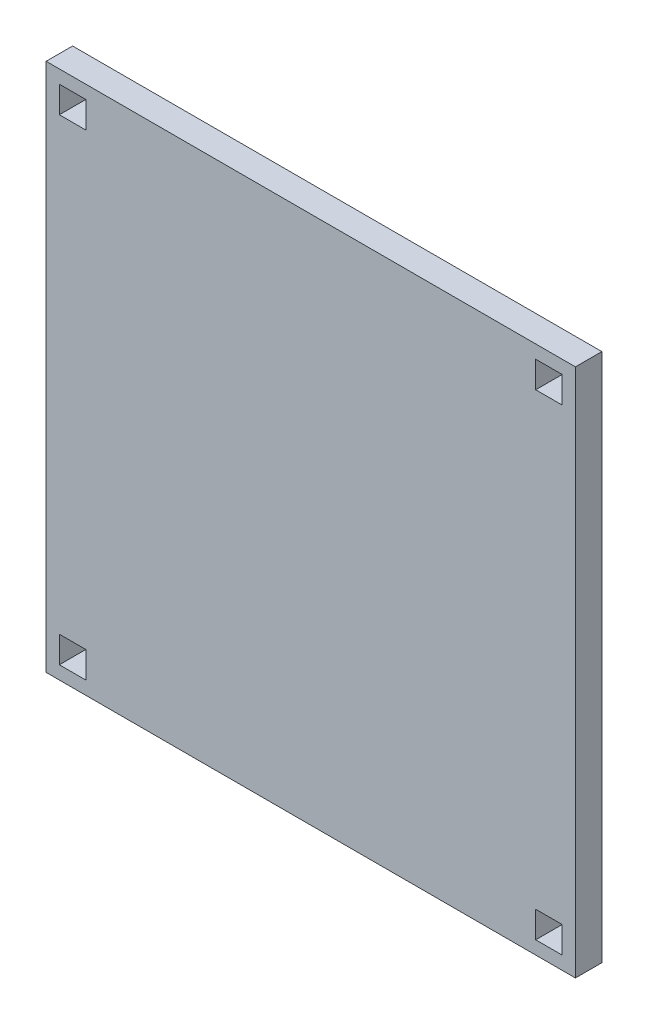
ISO-10303-21;
HEADER;
FILE_DESCRIPTION(('STEP AP214'),'2;1');
FILE_NAME('part.step','',(''),(''),'','','');
FILE_SCHEMA(('AUTOMOTIVE_DESIGN { 1 0 10303 214 1 1 1 1 }'));
ENDSEC;
DATA;
#1=APPLICATION_CONTEXT('core data for automotive mechanical design processes');
#2=APPLICATION_PROTOCOL_DEFINITION('international standard','automotive_design',2000,#1);
#3=PRODUCT_CONTEXT('',#1,'mechanical');
#4=PRODUCT('Part','Part','',(#3));
#5=PRODUCT_RELATED_PRODUCT_CATEGORY('part','',(#4));
#6=PRODUCT_DEFINITION_FORMATION('','',#4);
#7=PRODUCT_DEFINITION_CONTEXT('part definition',#1,'design');
#8=PRODUCT_DEFINITION('design','',#6,#7);
#9=PRODUCT_DEFINITION_SHAPE('','',#8);
#10=(LENGTH_UNIT() NAMED_UNIT(*) SI_UNIT(.MILLI.,.METRE.));
#11=(NAMED_UNIT(*) PLANE_ANGLE_UNIT() SI_UNIT($,.RADIAN.));
#12=(NAMED_UNIT(*) SI_UNIT($,.STERADIAN.) SOLID_ANGLE_UNIT());
#13=UNCERTAINTY_MEASURE_WITH_UNIT(LENGTH_MEASURE(1.E-05),#10,'distance_accuracy_value','');
#14=(GEOMETRIC_REPRESENTATION_CONTEXT(3) GLOBAL_UNCERTAINTY_ASSIGNED_CONTEXT((#13)) GLOBAL_UNIT_ASSIGNED_CONTEXT((#10,
#11,#12)) REPRESENTATION_CONTEXT('',''));
#15=CARTESIAN_POINT('',(0.,0.,0.));
#16=DIRECTION('',(0.,0.,1.));
#17=DIRECTION('',(1.,0.,0.));
#18=AXIS2_PLACEMENT_3D('',#15,#16,#17);
#19=CARTESIAN_POINT('',(0.,0.,50.));
#20=DIRECTION('',(0.,0.,-1.));
#21=DIRECTION('',(-1.,0.,0.));
#22=AXIS2_PLACEMENT_3D('',#19,#20,#21);
#23=PLANE('',#22);
#24=DIRECTION('',(0.,1.,0.));
#25=VECTOR('',#24,1.);
#26=CARTESIAN_POINT('',(475.,-475.,50.));
#27=LINE('',#26,#25);
#28=CARTESIAN_POINT('',(475.,-475.,50.));
#29=VERTEX_POINT('',#28);
#30=CARTESIAN_POINT('',(475.,-425.,50.));
#31=VERTEX_POINT('',#30);
#32=EDGE_CURVE('E214',#29,#31,#27,.T.);
#33=ORIENTED_EDGE('',*,*,#32,.F.);
#34=DIRECTION('',(1.,0.,0.));
#35=VECTOR('',#34,1.);
#36=CARTESIAN_POINT('',(425.,-475.,50.));
#37=LINE('',#36,#35);
#38=CARTESIAN_POINT('',(425.,-475.,50.));
#39=VERTEX_POINT('',#38);
#40=EDGE_CURVE('E222',#39,#29,#37,.T.);
#41=ORIENTED_EDGE('',*,*,#40,.F.);
#42=DIRECTION('',(0.,-1.,0.));
#43=VECTOR('',#42,1.);
#44=CARTESIAN_POINT('',(425.,-475.,50.));
#45=LINE('',#44,#43);
#46=CARTESIAN_POINT('',(425.,-425.,50.));
#47=VERTEX_POINT('',#46);
#48=EDGE_CURVE('E219',#47,#39,#45,.T.);
#49=ORIENTED_EDGE('',*,*,#48,.F.);
#50=DIRECTION('',(-1.,0.,0.));
#51=VECTOR('',#50,1.);
#52=CARTESIAN_POINT('',(425.,-425.,50.));
#53=LINE('',#52,#51);
#54=EDGE_CURVE('E216',#31,#47,#53,.T.);
#55=ORIENTED_EDGE('',*,*,#54,.F.);
#56=EDGE_LOOP('',(#33,#41,#49,#55));
#57=FACE_BOUND('',#56,.T.);
#58=DIRECTION('',(0.,1.,0.));
#59=VECTOR('',#58,1.);
#60=CARTESIAN_POINT('',(475.,425.,50.));
#61=LINE('',#60,#59);
#62=CARTESIAN_POINT('',(475.,425.,50.));
#63=VERTEX_POINT('',#62);
#64=CARTESIAN_POINT('',(475.,475.,50.));
#65=VERTEX_POINT('',#64);
#66=EDGE_CURVE('E276',#63,#65,#61,.T.);
#67=ORIENTED_EDGE('',*,*,#66,.F.);
#68=DIRECTION('',(1.,0.,0.));
#69=VECTOR('',#68,1.);
#70=CARTESIAN_POINT('',(425.,425.,50.));
#71=LINE('',#70,#69);
#72=CARTESIAN_POINT('',(425.,425.,50.));
#73=VERTEX_POINT('',#72);
#74=EDGE_CURVE('E284',#73,#63,#71,.T.);
#75=ORIENTED_EDGE('',*,*,#74,.F.);
#76=DIRECTION('',(0.,-1.,0.));
#77=VECTOR('',#76,1.);
#78=CARTESIAN_POINT('',(425.,425.,50.));
#79=LINE('',#78,#77);
#80=CARTESIAN_POINT('',(425.,475.,50.));
#81=VERTEX_POINT('',#80);
#82=EDGE_CURVE('E281',#81,#73,#79,.T.);
#83=ORIENTED_EDGE('',*,*,#82,.F.);
#84=DIRECTION('',(-1.,0.,0.));
#85=VECTOR('',#84,1.);
#86=CARTESIAN_POINT('',(425.,475.,50.));
#87=LINE('',#86,#85);
#88=EDGE_CURVE('E278',#65,#81,#87,.T.);
#89=ORIENTED_EDGE('',*,*,#88,.F.);
#90=EDGE_LOOP('',(#67,#75,#83,#89));
#91=FACE_BOUND('',#90,.T.);
#92=DIRECTION('',(0.,1.,0.));
#93=VECTOR('',#92,1.);
#94=CARTESIAN_POINT('',(500.,-500.,50.));
#95=LINE('',#94,#93);
#96=CARTESIAN_POINT('',(500.,-500.,50.));
#97=VERTEX_POINT('',#96);
#98=CARTESIAN_POINT('',(500.,500.,50.));
#99=VERTEX_POINT('',#98);
#100=EDGE_CURVE('E307',#97,#99,#95,.T.);
#101=ORIENTED_EDGE('',*,*,#100,.T.);
#102=DIRECTION('',(-1.,0.,0.));
#103=VECTOR('',#102,1.);
#104=CARTESIAN_POINT('',(-500.,500.,50.));
#105=LINE('',#104,#103);
#106=CARTESIAN_POINT('',(-500.,500.,50.));
#107=VERTEX_POINT('',#106);
#108=EDGE_CURVE('E310',#99,#107,#105,.T.);
#109=ORIENTED_EDGE('',*,*,#108,.T.);
#110=DIRECTION('',(0.,-1.,0.));
#111=VECTOR('',#110,1.);
#112=CARTESIAN_POINT('',(-500.,-500.,50.));
#113=LINE('',#112,#111);
#114=CARTESIAN_POINT('',(-500.,-500.,50.));
#115=VERTEX_POINT('',#114);
#116=EDGE_CURVE('E313',#107,#115,#113,.T.);
#117=ORIENTED_EDGE('',*,*,#116,.T.);
#118=DIRECTION('',(1.,0.,0.));
#119=VECTOR('',#118,1.);
#120=CARTESIAN_POINT('',(-500.,-500.,50.));
#121=LINE('',#120,#119);
#122=EDGE_CURVE('E315',#115,#97,#121,.T.);
#123=ORIENTED_EDGE('',*,*,#122,.T.);
#124=EDGE_LOOP('',(#101,#109,#117,#123));
#125=FACE_BOUND('',#124,.T.);
#126=DIRECTION('',(0.,1.,0.));
#127=VECTOR('',#126,1.);
#128=CARTESIAN_POINT('',(-425.,425.,50.));
#129=LINE('',#128,#127);
#130=CARTESIAN_POINT('',(-425.,425.,50.));
#131=VERTEX_POINT('',#130);
#132=CARTESIAN_POINT('',(-425.,475.,50.));
#133=VERTEX_POINT('',#132);
#134=EDGE_CURVE('E245',#131,#133,#129,.T.);
#135=ORIENTED_EDGE('',*,*,#134,.F.);
#136=DIRECTION('',(1.,0.,0.));
#137=VECTOR('',#136,1.);
#138=CARTESIAN_POINT('',(-475.,425.,50.));
#139=LINE('',#138,#137);
#140=CARTESIAN_POINT('',(-475.,425.,50.));
#141=VERTEX_POINT('',#140);
#142=EDGE_CURVE('E253',#141,#131,#139,.T.);
#143=ORIENTED_EDGE('',*,*,#142,.F.);
#144=DIRECTION('',(0.,-1.,0.));
#145=VECTOR('',#144,1.);
#146=CARTESIAN_POINT('',(-475.,425.,50.));
#147=LINE('',#146,#145);
#148=CARTESIAN_POINT('',(-475.,475.,50.));
#149=VERTEX_POINT('',#148);
#150=EDGE_CURVE('E250',#149,#141,#147,.T.);
#151=ORIENTED_EDGE('',*,*,#150,.F.);
#152=DIRECTION('',(-1.,0.,0.));
#153=VECTOR('',#152,1.);
#154=CARTESIAN_POINT('',(-475.,475.,50.));
#155=LINE('',#154,#153);
#156=EDGE_CURVE('E247',#133,#149,#155,.T.);
#157=ORIENTED_EDGE('',*,*,#156,.F.);
#158=EDGE_LOOP('',(#135,#143,#151,#157));
#159=FACE_BOUND('',#158,.T.);
#160=DIRECTION('',(0.,1.,0.));
#161=VECTOR('',#160,1.);
#162=CARTESIAN_POINT('',(-425.,-475.,50.));
#163=LINE('',#162,#161);
#164=CARTESIAN_POINT('',(-425.,-475.,50.));
#165=VERTEX_POINT('',#164);
#166=CARTESIAN_POINT('',(-425.,-425.,50.));
#167=VERTEX_POINT('',#166);
#168=EDGE_CURVE('E178',#165,#167,#163,.T.);
#169=ORIENTED_EDGE('',*,*,#168,.F.);
#170=DIRECTION('',(1.,0.,0.));
#171=VECTOR('',#170,1.);
#172=CARTESIAN_POINT('',(-475.,-475.,50.));
#173=LINE('',#172,#171);
#174=CARTESIAN_POINT('',(-475.,-475.,50.));
#175=VERTEX_POINT('',#174);
#176=EDGE_CURVE('E200',#175,#165,#173,.T.);
#177=ORIENTED_EDGE('',*,*,#176,.F.);
#178=DIRECTION('',(0.,-1.,0.));
#179=VECTOR('',#178,1.);
#180=CARTESIAN_POINT('',(-475.,-475.,50.));
#181=LINE('',#180,#179);
#182=CARTESIAN_POINT('',(-475.,-425.,50.));
#183=VERTEX_POINT('',#182);
#184=EDGE_CURVE('E198',#183,#175,#181,.T.);
#185=ORIENTED_EDGE('',*,*,#184,.F.);
#186=DIRECTION('',(-1.,0.,0.));
#187=VECTOR('',#186,1.);
#188=CARTESIAN_POINT('',(-475.,-425.,50.));
#189=LINE('',#188,#187);
#190=EDGE_CURVE('E186',#167,#183,#189,.T.);
#191=ORIENTED_EDGE('',*,*,#190,.F.);
#192=EDGE_LOOP('',(#169,#177,#185,#191));
#193=FACE_BOUND('',#192,.T.);
#194=ADVANCED_FACE('F41',(#57,#91,#125,#159,#193),#23,.F.);
#195=CARTESIAN_POINT('',(0.,0.,0.));
#196=DIRECTION('',(0.,0.,-1.));
#197=DIRECTION('',(-1.,0.,0.));
#198=AXIS2_PLACEMENT_3D('',#195,#196,#197);
#199=PLANE('',#198);
#200=DIRECTION('',(0.,1.,0.));
#201=VECTOR('',#200,1.);
#202=CARTESIAN_POINT('',(500.,-500.,0.));
#203=LINE('',#202,#201);
#204=CARTESIAN_POINT('',(500.,-500.,0.));
#205=VERTEX_POINT('',#204);
#206=CARTESIAN_POINT('',(500.,500.,0.));
#207=VERTEX_POINT('',#206);
#208=EDGE_CURVE('E306',#205,#207,#203,.T.);
#209=ORIENTED_EDGE('',*,*,#208,.F.);
#210=DIRECTION('',(1.,0.,0.));
#211=VECTOR('',#210,1.);
#212=CARTESIAN_POINT('',(-500.,-500.,0.));
#213=LINE('',#212,#211);
#214=CARTESIAN_POINT('',(-500.,-500.,0.));
#215=VERTEX_POINT('',#214);
#216=EDGE_CURVE('E311',#215,#205,#213,.T.);
#217=ORIENTED_EDGE('',*,*,#216,.F.);
#218=DIRECTION('',(0.,-1.,0.));
#219=VECTOR('',#218,1.);
#220=CARTESIAN_POINT('',(-500.,-500.,0.));
#221=LINE('',#220,#219);
#222=CARTESIAN_POINT('',(-500.,500.,0.));
#223=VERTEX_POINT('',#222);
#224=EDGE_CURVE('E322',#223,#215,#221,.T.);
#225=ORIENTED_EDGE('',*,*,#224,.F.);
#226=DIRECTION('',(-1.,0.,0.));
#227=VECTOR('',#226,1.);
#228=CARTESIAN_POINT('',(-500.,500.,0.));
#229=LINE('',#228,#227);
#230=EDGE_CURVE('E320',#207,#223,#229,.T.);
#231=ORIENTED_EDGE('',*,*,#230,.F.);
#232=EDGE_LOOP('',(#209,#217,#225,#231));
#233=FACE_BOUND('',#232,.T.);
#234=DIRECTION('',(1.,0.,0.));
#235=VECTOR('',#234,1.);
#236=CARTESIAN_POINT('',(425.,425.,0.));
#237=LINE('',#236,#235);
#238=CARTESIAN_POINT('',(425.,425.,0.));
#239=VERTEX_POINT('',#238);
#240=CARTESIAN_POINT('',(475.,425.,0.));
#241=VERTEX_POINT('',#240);
#242=EDGE_CURVE('E279',#239,#241,#237,.T.);
#243=ORIENTED_EDGE('',*,*,#242,.T.);
#244=DIRECTION('',(0.,1.,0.));
#245=VECTOR('',#244,1.);
#246=CARTESIAN_POINT('',(475.,425.,0.));
#247=LINE('',#246,#245);
#248=CARTESIAN_POINT('',(475.,475.,0.));
#249=VERTEX_POINT('',#248);
#250=EDGE_CURVE('E275',#241,#249,#247,.T.);
#251=ORIENTED_EDGE('',*,*,#250,.T.);
#252=DIRECTION('',(-1.,0.,0.));
#253=VECTOR('',#252,1.);
#254=CARTESIAN_POINT('',(425.,475.,0.));
#255=LINE('',#254,#253);
#256=CARTESIAN_POINT('',(425.,475.,0.));
#257=VERTEX_POINT('',#256);
#258=EDGE_CURVE('E289',#249,#257,#255,.T.);
#259=ORIENTED_EDGE('',*,*,#258,.T.);
#260=DIRECTION('',(0.,-1.,0.));
#261=VECTOR('',#260,1.);
#262=CARTESIAN_POINT('',(425.,425.,0.));
#263=LINE('',#262,#261);
#264=EDGE_CURVE('E292',#257,#239,#263,.T.);
#265=ORIENTED_EDGE('',*,*,#264,.T.);
#266=EDGE_LOOP('',(#243,#251,#259,#265));
#267=FACE_BOUND('',#266,.T.);
#268=DIRECTION('',(1.,0.,0.));
#269=VECTOR('',#268,1.);
#270=CARTESIAN_POINT('',(-475.,425.,0.));
#271=LINE('',#270,#269);
#272=CARTESIAN_POINT('',(-475.,425.,0.));
#273=VERTEX_POINT('',#272);
#274=CARTESIAN_POINT('',(-425.,425.,0.));
#275=VERTEX_POINT('',#274);
#276=EDGE_CURVE('E248',#273,#275,#271,.T.);
#277=ORIENTED_EDGE('',*,*,#276,.T.);
#278=DIRECTION('',(0.,1.,0.));
#279=VECTOR('',#278,1.);
#280=CARTESIAN_POINT('',(-425.,425.,0.));
#281=LINE('',#280,#279);
#282=CARTESIAN_POINT('',(-425.,475.,0.));
#283=VERTEX_POINT('',#282);
#284=EDGE_CURVE('E244',#275,#283,#281,.T.);
#285=ORIENTED_EDGE('',*,*,#284,.T.);
#286=DIRECTION('',(-1.,0.,0.));
#287=VECTOR('',#286,1.);
#288=CARTESIAN_POINT('',(-475.,475.,0.));
#289=LINE('',#288,#287);
#290=CARTESIAN_POINT('',(-475.,475.,0.));
#291=VERTEX_POINT('',#290);
#292=EDGE_CURVE('E258',#283,#291,#289,.T.);
#293=ORIENTED_EDGE('',*,*,#292,.T.);
#294=DIRECTION('',(0.,-1.,0.));
#295=VECTOR('',#294,1.);
#296=CARTESIAN_POINT('',(-475.,425.,0.));
#297=LINE('',#296,#295);
#298=EDGE_CURVE('E261',#291,#273,#297,.T.);
#299=ORIENTED_EDGE('',*,*,#298,.T.);
#300=EDGE_LOOP('',(#277,#285,#293,#299));
#301=FACE_BOUND('',#300,.T.);
#302=DIRECTION('',(1.,0.,0.));
#303=VECTOR('',#302,1.);
#304=CARTESIAN_POINT('',(425.,-475.,0.));
#305=LINE('',#304,#303);
#306=CARTESIAN_POINT('',(425.,-475.,0.));
#307=VERTEX_POINT('',#306);
#308=CARTESIAN_POINT('',(475.,-475.,0.));
#309=VERTEX_POINT('',#308);
#310=EDGE_CURVE('E217',#307,#309,#305,.T.);
#311=ORIENTED_EDGE('',*,*,#310,.T.);
#312=DIRECTION('',(0.,1.,0.));
#313=VECTOR('',#312,1.);
#314=CARTESIAN_POINT('',(475.,-475.,0.));
#315=LINE('',#314,#313);
#316=CARTESIAN_POINT('',(475.,-425.,0.));
#317=VERTEX_POINT('',#316);
#318=EDGE_CURVE('E194',#309,#317,#315,.T.);
#319=ORIENTED_EDGE('',*,*,#318,.T.);
#320=DIRECTION('',(-1.,0.,0.));
#321=VECTOR('',#320,1.);
#322=CARTESIAN_POINT('',(425.,-425.,0.));
#323=LINE('',#322,#321);
#324=CARTESIAN_POINT('',(425.,-425.,0.));
#325=VERTEX_POINT('',#324);
#326=EDGE_CURVE('E227',#317,#325,#323,.T.);
#327=ORIENTED_EDGE('',*,*,#326,.T.);
#328=DIRECTION('',(0.,-1.,0.));
#329=VECTOR('',#328,1.);
#330=CARTESIAN_POINT('',(425.,-475.,0.));
#331=LINE('',#330,#329);
#332=EDGE_CURVE('E230',#325,#307,#331,.T.);
#333=ORIENTED_EDGE('',*,*,#332,.T.);
#334=EDGE_LOOP('',(#311,#319,#327,#333));
#335=FACE_BOUND('',#334,.T.);
#336=DIRECTION('',(1.,0.,0.));
#337=VECTOR('',#336,1.);
#338=CARTESIAN_POINT('',(-475.,-475.,0.));
#339=LINE('',#338,#337);
#340=CARTESIAN_POINT('',(-475.,-475.,0.));
#341=VERTEX_POINT('',#340);
#342=CARTESIAN_POINT('',(-425.,-475.,0.));
#343=VERTEX_POINT('',#342);
#344=EDGE_CURVE('E187',#341,#343,#339,.T.);
#345=ORIENTED_EDGE('',*,*,#344,.T.);
#346=DIRECTION('',(0.,1.,0.));
#347=VECTOR('',#346,1.);
#348=CARTESIAN_POINT('',(-425.,-475.,0.));
#349=LINE('',#348,#347);
#350=CARTESIAN_POINT('',(-425.,-425.,0.));
#351=VERTEX_POINT('',#350);
#352=EDGE_CURVE('E64',#343,#351,#349,.T.);
#353=ORIENTED_EDGE('',*,*,#352,.T.);
#354=DIRECTION('',(-1.,0.,0.));
#355=VECTOR('',#354,1.);
#356=CARTESIAN_POINT('',(-475.,-425.,0.));
#357=LINE('',#356,#355);
#358=CARTESIAN_POINT('',(-475.,-425.,0.));
#359=VERTEX_POINT('',#358);
#360=EDGE_CURVE('E193',#351,#359,#357,.T.);
#361=ORIENTED_EDGE('',*,*,#360,.T.);
#362=DIRECTION('',(0.,-1.,0.));
#363=VECTOR('',#362,1.);
#364=CARTESIAN_POINT('',(-475.,-475.,0.));
#365=LINE('',#364,#363);
#366=EDGE_CURVE('E206',#359,#341,#365,.T.);
#367=ORIENTED_EDGE('',*,*,#366,.T.);
#368=EDGE_LOOP('',(#345,#353,#361,#367));
#369=FACE_BOUND('',#368,.T.);
#370=ADVANCED_FACE('F340',(#233,#267,#301,#335,#369),#199,.T.);
#371=CARTESIAN_POINT('',(500.,-500.,50.));
#372=DIRECTION('',(-1.,0.,0.));
#373=DIRECTION('',(0.,0.,1.));
#374=AXIS2_PLACEMENT_3D('',#371,#372,#373);
#375=PLANE('',#374);
#376=ORIENTED_EDGE('',*,*,#208,.T.);
#377=DIRECTION('',(0.,0.,-1.));
#378=VECTOR('',#377,1.);
#379=CARTESIAN_POINT('',(500.,500.,50.));
#380=LINE('',#379,#378);
#381=EDGE_CURVE('E11',#99,#207,#380,.T.);
#382=ORIENTED_EDGE('',*,*,#381,.F.);
#383=ORIENTED_EDGE('',*,*,#100,.F.);
#384=DIRECTION('',(0.,0.,-1.));
#385=VECTOR('',#384,1.);
#386=CARTESIAN_POINT('',(500.,-500.,50.));
#387=LINE('',#386,#385);
#388=EDGE_CURVE('E317',#97,#205,#387,.T.);
#389=ORIENTED_EDGE('',*,*,#388,.T.);
#390=EDGE_LOOP('',(#376,#382,#383,#389));
#391=FACE_BOUND('',#390,.T.);
#392=ADVANCED_FACE('F43',(#391),#375,.F.);
#393=CARTESIAN_POINT('',(-500.,500.,50.));
#394=DIRECTION('',(0.,-1.,0.));
#395=DIRECTION('',(0.,0.,-1.));
#396=AXIS2_PLACEMENT_3D('',#393,#394,#395);
#397=PLANE('',#396);
#398=ORIENTED_EDGE('',*,*,#230,.T.);
#399=DIRECTION('',(0.,0.,-1.));
#400=VECTOR('',#399,1.);
#401=CARTESIAN_POINT('',(-500.,500.,50.));
#402=LINE('',#401,#400);
#403=EDGE_CURVE('E49',#107,#223,#402,.T.);
#404=ORIENTED_EDGE('',*,*,#403,.F.);
#405=ORIENTED_EDGE('',*,*,#108,.F.);
#406=ORIENTED_EDGE('',*,*,#381,.T.);
#407=EDGE_LOOP('',(#398,#404,#405,#406));
#408=FACE_BOUND('',#407,.T.);
#409=ADVANCED_FACE('F351',(#408),#397,.F.);
#410=CARTESIAN_POINT('',(-500.,-500.,50.));
#411=DIRECTION('',(1.,0.,0.));
#412=DIRECTION('',(0.,0.,-1.));
#413=AXIS2_PLACEMENT_3D('',#410,#411,#412);
#414=PLANE('',#413);
#415=ORIENTED_EDGE('',*,*,#224,.T.);
#416=DIRECTION('',(0.,0.,-1.));
#417=VECTOR('',#416,1.);
#418=CARTESIAN_POINT('',(-500.,-500.,50.));
#419=LINE('',#418,#417);
#420=EDGE_CURVE('E327',#115,#215,#419,.T.);
#421=ORIENTED_EDGE('',*,*,#420,.F.);
#422=ORIENTED_EDGE('',*,*,#116,.F.);
#423=ORIENTED_EDGE('',*,*,#403,.T.);
#424=EDGE_LOOP('',(#415,#421,#422,#423));
#425=FACE_BOUND('',#424,.T.);
#426=ADVANCED_FACE('F334',(#425),#414,.F.);
#427=CARTESIAN_POINT('',(-500.,-500.,50.));
#428=DIRECTION('',(0.,1.,0.));
#429=DIRECTION('',(0.,0.,1.));
#430=AXIS2_PLACEMENT_3D('',#427,#428,#429);
#431=PLANE('',#430);
#432=ORIENTED_EDGE('',*,*,#216,.T.);
#433=ORIENTED_EDGE('',*,*,#388,.F.);
#434=ORIENTED_EDGE('',*,*,#122,.F.);
#435=ORIENTED_EDGE('',*,*,#420,.T.);
#436=EDGE_LOOP('',(#432,#433,#434,#435));
#437=FACE_BOUND('',#436,.T.);
#438=ADVANCED_FACE('F344',(#437),#431,.F.);
#439=CARTESIAN_POINT('',(475.,425.,50.));
#440=DIRECTION('',(-1.,0.,0.));
#441=DIRECTION('',(0.,0.,1.));
#442=AXIS2_PLACEMENT_3D('',#439,#440,#441);
#443=PLANE('',#442);
#444=ORIENTED_EDGE('',*,*,#250,.F.);
#445=DIRECTION('',(0.,0.,-1.));
#446=VECTOR('',#445,1.);
#447=CARTESIAN_POINT('',(475.,425.,50.));
#448=LINE('',#447,#446);
#449=EDGE_CURVE('E286',#63,#241,#448,.T.);
#450=ORIENTED_EDGE('',*,*,#449,.F.);
#451=ORIENTED_EDGE('',*,*,#66,.T.);
#452=DIRECTION('',(0.,0.,-1.));
#453=VECTOR('',#452,1.);
#454=CARTESIAN_POINT('',(475.,475.,50.));
#455=LINE('',#454,#453);
#456=EDGE_CURVE('E303',#65,#249,#455,.T.);
#457=ORIENTED_EDGE('',*,*,#456,.T.);
#458=EDGE_LOOP('',(#444,#450,#451,#457));
#459=FACE_BOUND('',#458,.T.);
#460=ADVANCED_FACE('F369',(#459),#443,.T.);
#461=CARTESIAN_POINT('',(425.,475.,50.));
#462=DIRECTION('',(0.,-1.,0.));
#463=DIRECTION('',(0.,0.,-1.));
#464=AXIS2_PLACEMENT_3D('',#461,#462,#463);
#465=PLANE('',#464);
#466=ORIENTED_EDGE('',*,*,#258,.F.);
#467=ORIENTED_EDGE('',*,*,#456,.F.);
#468=ORIENTED_EDGE('',*,*,#88,.T.);
#469=DIRECTION('',(0.,0.,-1.));
#470=VECTOR('',#469,1.);
#471=CARTESIAN_POINT('',(425.,475.,50.));
#472=LINE('',#471,#470);
#473=EDGE_CURVE('E301',#81,#257,#472,.T.);
#474=ORIENTED_EDGE('',*,*,#473,.T.);
#475=EDGE_LOOP('',(#466,#467,#468,#474));
#476=FACE_BOUND('',#475,.T.);
#477=ADVANCED_FACE('F376',(#476),#465,.T.);
#478=CARTESIAN_POINT('',(425.,425.,50.));
#479=DIRECTION('',(1.,0.,0.));
#480=DIRECTION('',(0.,0.,-1.));
#481=AXIS2_PLACEMENT_3D('',#478,#479,#480);
#482=PLANE('',#481);
#483=ORIENTED_EDGE('',*,*,#264,.F.);
#484=ORIENTED_EDGE('',*,*,#473,.F.);
#485=ORIENTED_EDGE('',*,*,#82,.T.);
#486=DIRECTION('',(0.,0.,-1.));
#487=VECTOR('',#486,1.);
#488=CARTESIAN_POINT('',(425.,425.,50.));
#489=LINE('',#488,#487);
#490=EDGE_CURVE('E299',#73,#239,#489,.T.);
#491=ORIENTED_EDGE('',*,*,#490,.T.);
#492=EDGE_LOOP('',(#483,#484,#485,#491));
#493=FACE_BOUND('',#492,.T.);
#494=ADVANCED_FACE('F381',(#493),#482,.T.);
#495=CARTESIAN_POINT('',(425.,425.,50.));
#496=DIRECTION('',(0.,1.,0.));
#497=DIRECTION('',(0.,0.,1.));
#498=AXIS2_PLACEMENT_3D('',#495,#496,#497);
#499=PLANE('',#498);
#500=ORIENTED_EDGE('',*,*,#242,.F.);
#501=ORIENTED_EDGE('',*,*,#490,.F.);
#502=ORIENTED_EDGE('',*,*,#74,.T.);
#503=ORIENTED_EDGE('',*,*,#449,.T.);
#504=EDGE_LOOP('',(#500,#501,#502,#503));
#505=FACE_BOUND('',#504,.T.);
#506=ADVANCED_FACE('F388',(#505),#499,.T.);
#507=CARTESIAN_POINT('',(-425.,425.,50.));
#508=DIRECTION('',(-1.,0.,0.));
#509=DIRECTION('',(0.,0.,1.));
#510=AXIS2_PLACEMENT_3D('',#507,#508,#509);
#511=PLANE('',#510);
#512=ORIENTED_EDGE('',*,*,#284,.F.);
#513=DIRECTION('',(0.,0.,-1.));
#514=VECTOR('',#513,1.);
#515=CARTESIAN_POINT('',(-425.,425.,50.));
#516=LINE('',#515,#514);
#517=EDGE_CURVE('E255',#131,#275,#516,.T.);
#518=ORIENTED_EDGE('',*,*,#517,.F.);
#519=ORIENTED_EDGE('',*,*,#134,.T.);
#520=DIRECTION('',(0.,0.,-1.));
#521=VECTOR('',#520,1.);
#522=CARTESIAN_POINT('',(-425.,475.,50.));
#523=LINE('',#522,#521);
#524=EDGE_CURVE('E272',#133,#283,#523,.T.);
#525=ORIENTED_EDGE('',*,*,#524,.T.);
#526=EDGE_LOOP('',(#512,#518,#519,#525));
#527=FACE_BOUND('',#526,.T.);
#528=ADVANCED_FACE('F401',(#527),#511,.T.);
#529=CARTESIAN_POINT('',(-475.,475.,50.));
#530=DIRECTION('',(0.,-1.,0.));
#531=DIRECTION('',(0.,0.,-1.));
#532=AXIS2_PLACEMENT_3D('',#529,#530,#531);
#533=PLANE('',#532);
#534=ORIENTED_EDGE('',*,*,#292,.F.);
#535=ORIENTED_EDGE('',*,*,#524,.F.);
#536=ORIENTED_EDGE('',*,*,#156,.T.);
#537=DIRECTION('',(0.,0.,-1.));
#538=VECTOR('',#537,1.);
#539=CARTESIAN_POINT('',(-475.,475.,50.));
#540=LINE('',#539,#538);
#541=EDGE_CURVE('E270',#149,#291,#540,.T.);
#542=ORIENTED_EDGE('',*,*,#541,.T.);
#543=EDGE_LOOP('',(#534,#535,#536,#542));
#544=FACE_BOUND('',#543,.T.);
#545=ADVANCED_FACE('F406',(#544),#533,.T.);
#546=CARTESIAN_POINT('',(-475.,425.,50.));
#547=DIRECTION('',(1.,0.,0.));
#548=DIRECTION('',(0.,0.,-1.));
#549=AXIS2_PLACEMENT_3D('',#546,#547,#548);
#550=PLANE('',#549);
#551=ORIENTED_EDGE('',*,*,#298,.F.);
#552=ORIENTED_EDGE('',*,*,#541,.F.);
#553=ORIENTED_EDGE('',*,*,#150,.T.);
#554=DIRECTION('',(0.,0.,-1.));
#555=VECTOR('',#554,1.);
#556=CARTESIAN_POINT('',(-475.,425.,50.));
#557=LINE('',#556,#555);
#558=EDGE_CURVE('E268',#141,#273,#557,.T.);
#559=ORIENTED_EDGE('',*,*,#558,.T.);
#560=EDGE_LOOP('',(#551,#552,#553,#559));
#561=FACE_BOUND('',#560,.T.);
#562=ADVANCED_FACE('F410',(#561),#550,.T.);
#563=CARTESIAN_POINT('',(-475.,425.,50.));
#564=DIRECTION('',(0.,1.,0.));
#565=DIRECTION('',(0.,0.,1.));
#566=AXIS2_PLACEMENT_3D('',#563,#564,#565);
#567=PLANE('',#566);
#568=ORIENTED_EDGE('',*,*,#276,.F.);
#569=ORIENTED_EDGE('',*,*,#558,.F.);
#570=ORIENTED_EDGE('',*,*,#142,.T.);
#571=ORIENTED_EDGE('',*,*,#517,.T.);
#572=EDGE_LOOP('',(#568,#569,#570,#571));
#573=FACE_BOUND('',#572,.T.);
#574=ADVANCED_FACE('F414',(#573),#567,.T.);
#575=CARTESIAN_POINT('',(475.,-475.,50.));
#576=DIRECTION('',(-1.,0.,0.));
#577=DIRECTION('',(0.,0.,1.));
#578=AXIS2_PLACEMENT_3D('',#575,#576,#577);
#579=PLANE('',#578);
#580=ORIENTED_EDGE('',*,*,#318,.F.);
#581=DIRECTION('',(0.,0.,-1.));
#582=VECTOR('',#581,1.);
#583=CARTESIAN_POINT('',(475.,-475.,50.));
#584=LINE('',#583,#582);
#585=EDGE_CURVE('E224',#29,#309,#584,.T.);
#586=ORIENTED_EDGE('',*,*,#585,.F.);
#587=ORIENTED_EDGE('',*,*,#32,.T.);
#588=DIRECTION('',(0.,0.,-1.));
#589=VECTOR('',#588,1.);
#590=CARTESIAN_POINT('',(475.,-425.,50.));
#591=LINE('',#590,#589);
#592=EDGE_CURVE('E241',#31,#317,#591,.T.);
#593=ORIENTED_EDGE('',*,*,#592,.T.);
#594=EDGE_LOOP('',(#580,#586,#587,#593));
#595=FACE_BOUND('',#594,.T.);
#596=ADVANCED_FACE('F418',(#595),#579,.T.);
#597=CARTESIAN_POINT('',(425.,-425.,50.));
#598=DIRECTION('',(0.,-1.,0.));
#599=DIRECTION('',(0.,0.,-1.));
#600=AXIS2_PLACEMENT_3D('',#597,#598,#599);
#601=PLANE('',#600);
#602=ORIENTED_EDGE('',*,*,#326,.F.);
#603=ORIENTED_EDGE('',*,*,#592,.F.);
#604=ORIENTED_EDGE('',*,*,#54,.T.);
#605=DIRECTION('',(0.,0.,-1.));
#606=VECTOR('',#605,1.);
#607=CARTESIAN_POINT('',(425.,-425.,50.));
#608=LINE('',#607,#606);
#609=EDGE_CURVE('E239',#47,#325,#608,.T.);
#610=ORIENTED_EDGE('',*,*,#609,.T.);
#611=EDGE_LOOP('',(#602,#603,#604,#610));
#612=FACE_BOUND('',#611,.T.);
#613=ADVANCED_FACE('F422',(#612),#601,.T.);
#614=CARTESIAN_POINT('',(425.,-475.,50.));
#615=DIRECTION('',(1.,0.,0.));
#616=DIRECTION('',(0.,0.,-1.));
#617=AXIS2_PLACEMENT_3D('',#614,#615,#616);
#618=PLANE('',#617);
#619=ORIENTED_EDGE('',*,*,#332,.F.);
#620=ORIENTED_EDGE('',*,*,#609,.F.);
#621=ORIENTED_EDGE('',*,*,#48,.T.);
#622=DIRECTION('',(0.,0.,-1.));
#623=VECTOR('',#622,1.);
#624=CARTESIAN_POINT('',(425.,-475.,50.));
#625=LINE('',#624,#623);
#626=EDGE_CURVE('E237',#39,#307,#625,.T.);
#627=ORIENTED_EDGE('',*,*,#626,.T.);
#628=EDGE_LOOP('',(#619,#620,#621,#627));
#629=FACE_BOUND('',#628,.T.);
#630=ADVANCED_FACE('F426',(#629),#618,.T.);
#631=CARTESIAN_POINT('',(425.,-475.,50.));
#632=DIRECTION('',(0.,1.,0.));
#633=DIRECTION('',(0.,0.,1.));
#634=AXIS2_PLACEMENT_3D('',#631,#632,#633);
#635=PLANE('',#634);
#636=ORIENTED_EDGE('',*,*,#310,.F.);
#637=ORIENTED_EDGE('',*,*,#626,.F.);
#638=ORIENTED_EDGE('',*,*,#40,.T.);
#639=ORIENTED_EDGE('',*,*,#585,.T.);
#640=EDGE_LOOP('',(#636,#637,#638,#639));
#641=FACE_BOUND('',#640,.T.);
#642=ADVANCED_FACE('F430',(#641),#635,.T.);
#643=CARTESIAN_POINT('',(-425.,-475.,50.));
#644=DIRECTION('',(-1.,0.,0.));
#645=DIRECTION('',(0.,0.,1.));
#646=AXIS2_PLACEMENT_3D('',#643,#644,#645);
#647=PLANE('',#646);
#648=ORIENTED_EDGE('',*,*,#352,.F.);
#649=DIRECTION('',(0.,0.,-1.));
#650=VECTOR('',#649,1.);
#651=CARTESIAN_POINT('',(-425.,-475.,50.));
#652=LINE('',#651,#650);
#653=EDGE_CURVE('E182',#165,#343,#652,.T.);
#654=ORIENTED_EDGE('',*,*,#653,.F.);
#655=ORIENTED_EDGE('',*,*,#168,.T.);
#656=DIRECTION('',(0.,0.,-1.));
#657=VECTOR('',#656,1.);
#658=CARTESIAN_POINT('',(-425.,-425.,50.));
#659=LINE('',#658,#657);
#660=EDGE_CURVE('E181',#167,#351,#659,.T.);
#661=ORIENTED_EDGE('',*,*,#660,.T.);
#662=EDGE_LOOP('',(#648,#654,#655,#661));
#663=FACE_BOUND('',#662,.T.);
#664=ADVANCED_FACE('F180',(#663),#647,.T.);
#665=CARTESIAN_POINT('',(-475.,-425.,50.));
#666=DIRECTION('',(0.,-1.,0.));
#667=DIRECTION('',(0.,0.,-1.));
#668=AXIS2_PLACEMENT_3D('',#665,#666,#667);
#669=PLANE('',#668);
#670=ORIENTED_EDGE('',*,*,#360,.F.);
#671=ORIENTED_EDGE('',*,*,#660,.F.);
#672=ORIENTED_EDGE('',*,*,#190,.T.);
#673=DIRECTION('',(0.,0.,-1.));
#674=VECTOR('',#673,1.);
#675=CARTESIAN_POINT('',(-475.,-425.,50.));
#676=LINE('',#675,#674);
#677=EDGE_CURVE('E195',#183,#359,#676,.T.);
#678=ORIENTED_EDGE('',*,*,#677,.T.);
#679=EDGE_LOOP('',(#670,#671,#672,#678));
#680=FACE_BOUND('',#679,.T.);
#681=ADVANCED_FACE('F190',(#680),#669,.T.);
#682=CARTESIAN_POINT('',(-475.,-475.,50.));
#683=DIRECTION('',(1.,0.,0.));
#684=DIRECTION('',(0.,0.,-1.));
#685=AXIS2_PLACEMENT_3D('',#682,#683,#684);
#686=PLANE('',#685);
#687=ORIENTED_EDGE('',*,*,#366,.F.);
#688=ORIENTED_EDGE('',*,*,#677,.F.);
#689=ORIENTED_EDGE('',*,*,#184,.T.);
#690=DIRECTION('',(0.,0.,-1.));
#691=VECTOR('',#690,1.);
#692=CARTESIAN_POINT('',(-475.,-475.,50.));
#693=LINE('',#692,#691);
#694=EDGE_CURVE('E56',#175,#341,#693,.T.);
#695=ORIENTED_EDGE('',*,*,#694,.T.);
#696=EDGE_LOOP('',(#687,#688,#689,#695));
#697=FACE_BOUND('',#696,.T.);
#698=ADVANCED_FACE('F438',(#697),#686,.T.);
#699=CARTESIAN_POINT('',(-475.,-475.,50.));
#700=DIRECTION('',(0.,1.,0.));
#701=DIRECTION('',(0.,0.,1.));
#702=AXIS2_PLACEMENT_3D('',#699,#700,#701);
#703=PLANE('',#702);
#704=ORIENTED_EDGE('',*,*,#344,.F.);
#705=ORIENTED_EDGE('',*,*,#694,.F.);
#706=ORIENTED_EDGE('',*,*,#176,.T.);
#707=ORIENTED_EDGE('',*,*,#653,.T.);
#708=EDGE_LOOP('',(#704,#705,#706,#707));
#709=FACE_BOUND('',#708,.T.);
#710=ADVANCED_FACE('F441',(#709),#703,.T.);
#711=CLOSED_SHELL('',(#194,#370,#392,#409,#426,#438,#460,#477,#494,#506,#528,#545,#562,#574,
#596,#613,#630,#642,#664,#681,#698,#710));
#712=MANIFOLD_SOLID_BREP('B2',#711);
#713=ADVANCED_BREP_SHAPE_REPRESENTATION('',(#18,#712),#14);
#714=SHAPE_DEFINITION_REPRESENTATION(#9,#713);
ENDSEC;
END-ISO-10303-21;
